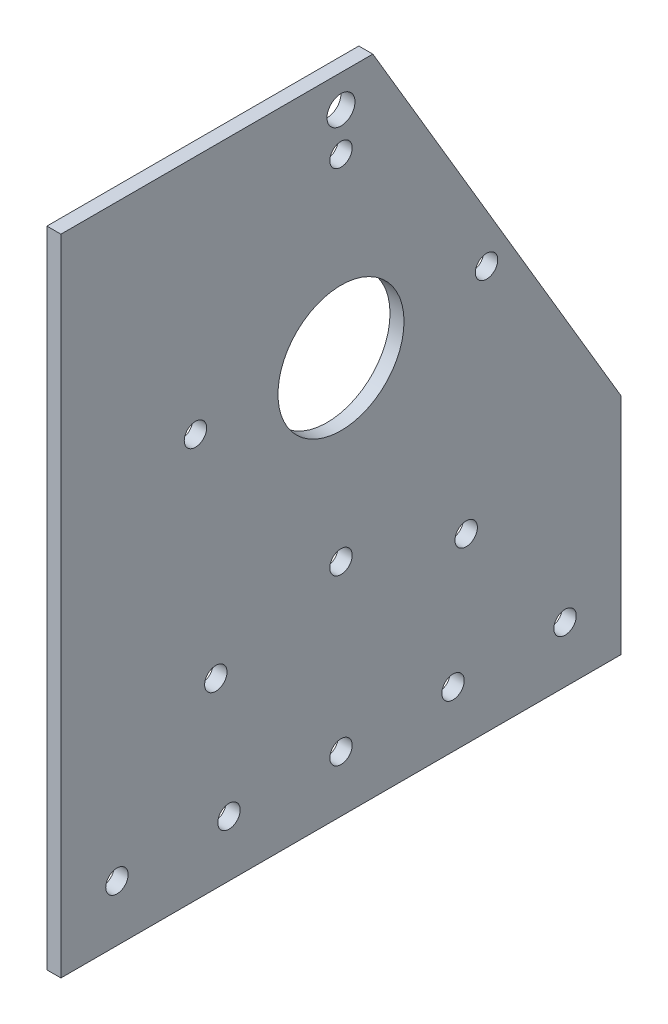
ISO-10303-21;
HEADER;
FILE_DESCRIPTION(('STEP AP214'),'2;1');
FILE_NAME('part.step','',(''),(''),'','','');
FILE_SCHEMA(('AUTOMOTIVE_DESIGN { 1 0 10303 214 1 1 1 1 }'));
ENDSEC;
DATA;
#1=APPLICATION_CONTEXT('core data for automotive mechanical design processes');
#2=APPLICATION_PROTOCOL_DEFINITION('international standard','automotive_design',2000,#1);
#3=PRODUCT_CONTEXT('',#1,'mechanical');
#4=PRODUCT('Part','Part','',(#3));
#5=PRODUCT_RELATED_PRODUCT_CATEGORY('part','',(#4));
#6=PRODUCT_DEFINITION_FORMATION('','',#4);
#7=PRODUCT_DEFINITION_CONTEXT('part definition',#1,'design');
#8=PRODUCT_DEFINITION('design','',#6,#7);
#9=PRODUCT_DEFINITION_SHAPE('','',#8);
#10=(LENGTH_UNIT() NAMED_UNIT(*) SI_UNIT(.MILLI.,.METRE.));
#11=(NAMED_UNIT(*) PLANE_ANGLE_UNIT() SI_UNIT($,.RADIAN.));
#12=(NAMED_UNIT(*) SI_UNIT($,.STERADIAN.) SOLID_ANGLE_UNIT());
#13=UNCERTAINTY_MEASURE_WITH_UNIT(LENGTH_MEASURE(1.E-05),#10,'distance_accuracy_value','');
#14=(GEOMETRIC_REPRESENTATION_CONTEXT(3) GLOBAL_UNCERTAINTY_ASSIGNED_CONTEXT((#13)) GLOBAL_UNIT_ASSIGNED_CONTEXT((#10,
#11,#12)) REPRESENTATION_CONTEXT('',''));
#15=CARTESIAN_POINT('',(0.,0.,0.));
#16=DIRECTION('',(0.,0.,1.));
#17=DIRECTION('',(1.,0.,0.));
#18=AXIS2_PLACEMENT_3D('',#15,#16,#17);
#19=CARTESIAN_POINT('',(-3.175,0.,0.));
#20=DIRECTION('',(-1.,0.,0.));
#21=DIRECTION('',(0.,0.,1.));
#22=AXIS2_PLACEMENT_3D('',#19,#20,#21);
#23=PLANE('',#22);
#24=CARTESIAN_POINT('',(-3.175,-82.55,25.4));
#25=DIRECTION('',(-1.,0.,0.));
#26=DIRECTION('',(0.,0.,1.));
#27=AXIS2_PLACEMENT_3D('',#24,#25,#26);
#28=CIRCLE('',#27,2.54);
#29=CARTESIAN_POINT('',(-3.175,-82.55,27.94));
#30=VERTEX_POINT('',#29);
#31=EDGE_CURVE('E186',#30,#30,#28,.T.);
#32=ORIENTED_EDGE('',*,*,#31,.F.);
#33=EDGE_LOOP('',(#32));
#34=FACE_BOUND('',#33,.T.);
#35=CARTESIAN_POINT('',(-3.175,-82.55,-25.4));
#36=DIRECTION('',(-1.,0.,0.));
#37=DIRECTION('',(0.,0.,1.));
#38=AXIS2_PLACEMENT_3D('',#35,#36,#37);
#39=CIRCLE('',#38,2.54);
#40=CARTESIAN_POINT('',(-3.175,-82.55,-22.86));
#41=VERTEX_POINT('',#40);
#42=EDGE_CURVE('E180',#41,#41,#39,.T.);
#43=ORIENTED_EDGE('',*,*,#42,.F.);
#44=EDGE_LOOP('',(#43));
#45=FACE_BOUND('',#44,.T.);
#46=CARTESIAN_POINT('',(-3.175,-82.55,50.8));
#47=DIRECTION('',(-1.,0.,0.));
#48=DIRECTION('',(0.,0.,1.));
#49=AXIS2_PLACEMENT_3D('',#46,#47,#48);
#50=CIRCLE('',#49,2.54);
#51=CARTESIAN_POINT('',(-3.175,-82.55,53.34));
#52=VERTEX_POINT('',#51);
#53=EDGE_CURVE('E174',#52,#52,#50,.T.);
#54=ORIENTED_EDGE('',*,*,#53,.F.);
#55=EDGE_LOOP('',(#54));
#56=FACE_BOUND('',#55,.T.);
#57=CARTESIAN_POINT('',(-3.175,-82.55,0.));
#58=DIRECTION('',(-1.,0.,0.));
#59=DIRECTION('',(0.,0.,1.));
#60=AXIS2_PLACEMENT_3D('',#57,#58,#59);
#61=CIRCLE('',#60,2.54);
#62=CARTESIAN_POINT('',(-3.175,-82.55,2.53999999999999));
#63=VERTEX_POINT('',#62);
#64=EDGE_CURVE('E168',#63,#63,#61,.T.);
#65=ORIENTED_EDGE('',*,*,#64,.F.);
#66=EDGE_LOOP('',(#65));
#67=FACE_BOUND('',#66,.T.);
#68=CARTESIAN_POINT('',(-3.175,-82.55,-50.8));
#69=DIRECTION('',(-1.,0.,0.));
#70=DIRECTION('',(0.,0.,1.));
#71=AXIS2_PLACEMENT_3D('',#68,#69,#70);
#72=CIRCLE('',#71,2.54);
#73=CARTESIAN_POINT('',(-3.175,-82.55,-48.26));
#74=VERTEX_POINT('',#73);
#75=EDGE_CURVE('E162',#74,#74,#72,.T.);
#76=ORIENTED_EDGE('',*,*,#75,.F.);
#77=EDGE_LOOP('',(#76));
#78=FACE_BOUND('',#77,.T.);
#79=CARTESIAN_POINT('',(-3.175,-45.239299666,0.));
#80=DIRECTION('',(-1.,0.,0.));
#81=DIRECTION('',(0.,0.,-1.));
#82=AXIS2_PLACEMENT_3D('',#79,#80,#81);
#83=CIRCLE('',#82,2.54);
#84=CARTESIAN_POINT('',(-3.175,-45.239299666,-2.54));
#85=VERTEX_POINT('',#84);
#86=EDGE_CURVE('E142',#85,#85,#83,.T.);
#87=ORIENTED_EDGE('',*,*,#86,.F.);
#88=EDGE_LOOP('',(#87));
#89=FACE_BOUND('',#88,.T.);
#90=CARTESIAN_POINT('',(-3.175,-3.74917106400003,-33.00000004));
#91=DIRECTION('',(-1.,0.,0.));
#92=DIRECTION('',(0.,0.,1.));
#93=AXIS2_PLACEMENT_3D('',#90,#91,#92);
#94=CIRCLE('',#93,2.54);
#95=CARTESIAN_POINT('',(-3.175,-3.74917106400003,-30.46000004));
#96=VERTEX_POINT('',#95);
#97=EDGE_CURVE('E136',#96,#96,#94,.T.);
#98=ORIENTED_EDGE('',*,*,#97,.F.);
#99=EDGE_LOOP('',(#98));
#100=FACE_BOUND('',#99,.T.);
#101=CARTESIAN_POINT('',(-3.175,-3.74917106400003,33.00000004));
#102=DIRECTION('',(-1.,0.,0.));
#103=DIRECTION('',(0.,0.,1.));
#104=AXIS2_PLACEMENT_3D('',#101,#102,#103);
#105=CIRCLE('',#104,2.54);
#106=CARTESIAN_POINT('',(-3.175,-3.74917106400003,35.54000004));
#107=VERTEX_POINT('',#106);
#108=EDGE_CURVE('E130',#107,#107,#105,.T.);
#109=ORIENTED_EDGE('',*,*,#108,.F.);
#110=EDGE_LOOP('',(#109));
#111=FACE_BOUND('',#110,.T.);
#112=CARTESIAN_POINT('',(-3.175,34.740957442,0.));
#113=DIRECTION('',(-1.,0.,0.));
#114=DIRECTION('',(0.,0.,1.));
#115=AXIS2_PLACEMENT_3D('',#112,#113,#114);
#116=CIRCLE('',#115,2.54);
#117=CARTESIAN_POINT('',(-3.175,34.740957442,2.54));
#118=VERTEX_POINT('',#117);
#119=EDGE_CURVE('E124',#118,#118,#116,.T.);
#120=ORIENTED_EDGE('',*,*,#119,.F.);
#121=EDGE_LOOP('',(#120));
#122=FACE_BOUND('',#121,.T.);
#123=CARTESIAN_POINT('',(-3.175,-5.24917111200003,0.));
#124=DIRECTION('',(1.,0.,0.));
#125=DIRECTION('',(0.,0.,-1.));
#126=AXIS2_PLACEMENT_3D('',#123,#124,#125);
#127=CIRCLE('',#126,14.2875);
#128=CARTESIAN_POINT('',(-3.175,-5.24917111200003,-14.2875));
#129=VERTEX_POINT('',#128);
#130=EDGE_CURVE('E115',#129,#129,#127,.T.);
#131=ORIENTED_EDGE('',*,*,#130,.T.);
#132=EDGE_LOOP('',(#131));
#133=FACE_BOUND('',#132,.T.);
#134=CARTESIAN_POINT('',(-3.175,43.476657776,0.));
#135=DIRECTION('',(1.,0.,0.));
#136=DIRECTION('',(0.,0.,-1.));
#137=AXIS2_PLACEMENT_3D('',#134,#135,#136);
#138=CIRCLE('',#137,3.175);
#139=CARTESIAN_POINT('',(-3.175,43.476657776,-3.17500000000001));
#140=VERTEX_POINT('',#139);
#141=EDGE_CURVE('E109',#140,#140,#138,.T.);
#142=ORIENTED_EDGE('',*,*,#141,.T.);
#143=EDGE_LOOP('',(#142));
#144=FACE_BOUND('',#143,.T.);
#145=CARTESIAN_POINT('',(-3.175,-53.975,-28.380000009));
#146=DIRECTION('',(1.,0.,0.));
#147=DIRECTION('',(0.,0.,-1.));
#148=AXIS2_PLACEMENT_3D('',#145,#146,#147);
#149=CIRCLE('',#148,2.54);
#150=CARTESIAN_POINT('',(-3.175,-53.975,-30.920000009));
#151=VERTEX_POINT('',#150);
#152=EDGE_CURVE('E103',#151,#151,#149,.T.);
#153=ORIENTED_EDGE('',*,*,#152,.T.);
#154=EDGE_LOOP('',(#153));
#155=FACE_BOUND('',#154,.T.);
#156=CARTESIAN_POINT('',(-3.175,-53.975,28.380000009));
#157=DIRECTION('',(1.,0.,0.));
#158=DIRECTION('',(0.,0.,-1.));
#159=AXIS2_PLACEMENT_3D('',#156,#157,#158);
#160=CIRCLE('',#159,2.54);
#161=CARTESIAN_POINT('',(-3.175,-53.975,25.840000009));
#162=VERTEX_POINT('',#161);
#163=EDGE_CURVE('E87',#162,#162,#160,.T.);
#164=ORIENTED_EDGE('',*,*,#163,.T.);
#165=EDGE_LOOP('',(#164));
#166=FACE_BOUND('',#165,.T.);
#167=DIRECTION('',(0.,-1.,0.));
#168=VECTOR('',#167,1.);
#169=CARTESIAN_POINT('',(-3.175,-95.25,63.5));
#170=LINE('',#169,#168);
#171=CARTESIAN_POINT('',(-3.175,50.8,63.5));
#172=VERTEX_POINT('',#171);
#173=CARTESIAN_POINT('',(-3.175,-95.25,63.5));
#174=VERTEX_POINT('',#173);
#175=EDGE_CURVE('E94',#172,#174,#170,.T.);
#176=ORIENTED_EDGE('',*,*,#175,.F.);
#177=DIRECTION('',(0.,0.,1.));
#178=VECTOR('',#177,1.);
#179=CARTESIAN_POINT('',(-3.175,50.8,63.5));
#180=LINE('',#179,#178);
#181=CARTESIAN_POINT('',(-3.175,50.8,-7.21590909090913));
#182=VERTEX_POINT('',#181);
#183=EDGE_CURVE('E157',#182,#172,#180,.T.);
#184=ORIENTED_EDGE('',*,*,#183,.F.);
#185=DIRECTION('',(0.,0.860926528214316,0.508729312126641));
#186=VECTOR('',#185,1.);
#187=CARTESIAN_POINT('',(-3.175,16.3077335375192,-27.5977029096478));
#188=LINE('',#187,#186);
#189=CARTESIAN_POINT('',(-3.175,-44.45,-63.5));
#190=VERTEX_POINT('',#189);
#191=EDGE_CURVE('E149',#190,#182,#188,.T.);
#192=ORIENTED_EDGE('',*,*,#191,.F.);
#193=DIRECTION('',(0.,1.,0.));
#194=VECTOR('',#193,1.);
#195=CARTESIAN_POINT('',(-3.175,-95.25,-63.5));
#196=LINE('',#195,#194);
#197=CARTESIAN_POINT('',(-3.175,-95.25,-63.5));
#198=VERTEX_POINT('',#197);
#199=EDGE_CURVE('E92',#198,#190,#196,.T.);
#200=ORIENTED_EDGE('',*,*,#199,.F.);
#201=DIRECTION('',(0.,0.,-1.));
#202=VECTOR('',#201,1.);
#203=CARTESIAN_POINT('',(-3.175,-95.25,63.5));
#204=LINE('',#203,#202);
#205=EDGE_CURVE('E78',#174,#198,#204,.T.);
#206=ORIENTED_EDGE('',*,*,#205,.F.);
#207=EDGE_LOOP('',(#176,#184,#192,#200,#206));
#208=FACE_BOUND('',#207,.T.);
#209=ADVANCED_FACE('F38',(#34,#45,#56,#67,#78,#89,#100,#111,#122,#133,#144,#155,#166,#208),#23,.T.);
#210=CARTESIAN_POINT('',(0.,0.,0.));
#211=DIRECTION('',(-1.,0.,0.));
#212=DIRECTION('',(0.,0.,1.));
#213=AXIS2_PLACEMENT_3D('',#210,#211,#212);
#214=PLANE('',#213);
#215=CARTESIAN_POINT('',(0.,-82.55,25.4));
#216=DIRECTION('',(-1.,0.,0.));
#217=DIRECTION('',(0.,0.,1.));
#218=AXIS2_PLACEMENT_3D('',#215,#216,#217);
#219=CIRCLE('',#218,2.54);
#220=CARTESIAN_POINT('',(0.,-82.55,27.94));
#221=VERTEX_POINT('',#220);
#222=EDGE_CURVE('E183',#221,#221,#219,.T.);
#223=ORIENTED_EDGE('',*,*,#222,.T.);
#224=EDGE_LOOP('',(#223));
#225=FACE_BOUND('',#224,.T.);
#226=CARTESIAN_POINT('',(0.,-82.55,-25.4));
#227=DIRECTION('',(-1.,0.,0.));
#228=DIRECTION('',(0.,0.,1.));
#229=AXIS2_PLACEMENT_3D('',#226,#227,#228);
#230=CIRCLE('',#229,2.54);
#231=CARTESIAN_POINT('',(0.,-82.55,-22.86));
#232=VERTEX_POINT('',#231);
#233=EDGE_CURVE('E177',#232,#232,#230,.T.);
#234=ORIENTED_EDGE('',*,*,#233,.T.);
#235=EDGE_LOOP('',(#234));
#236=FACE_BOUND('',#235,.T.);
#237=CARTESIAN_POINT('',(0.,-82.55,50.8));
#238=DIRECTION('',(-1.,0.,0.));
#239=DIRECTION('',(0.,0.,1.));
#240=AXIS2_PLACEMENT_3D('',#237,#238,#239);
#241=CIRCLE('',#240,2.54);
#242=CARTESIAN_POINT('',(0.,-82.55,53.34));
#243=VERTEX_POINT('',#242);
#244=EDGE_CURVE('E171',#243,#243,#241,.T.);
#245=ORIENTED_EDGE('',*,*,#244,.T.);
#246=EDGE_LOOP('',(#245));
#247=FACE_BOUND('',#246,.T.);
#248=CARTESIAN_POINT('',(0.,-82.55,0.));
#249=DIRECTION('',(-1.,0.,0.));
#250=DIRECTION('',(0.,0.,1.));
#251=AXIS2_PLACEMENT_3D('',#248,#249,#250);
#252=CIRCLE('',#251,2.54);
#253=CARTESIAN_POINT('',(0.,-82.55,2.53999999999999));
#254=VERTEX_POINT('',#253);
#255=EDGE_CURVE('E165',#254,#254,#252,.T.);
#256=ORIENTED_EDGE('',*,*,#255,.T.);
#257=EDGE_LOOP('',(#256));
#258=FACE_BOUND('',#257,.T.);
#259=CARTESIAN_POINT('',(0.,-82.55,-50.8));
#260=DIRECTION('',(-1.,0.,0.));
#261=DIRECTION('',(0.,0.,1.));
#262=AXIS2_PLACEMENT_3D('',#259,#260,#261);
#263=CIRCLE('',#262,2.54);
#264=CARTESIAN_POINT('',(0.,-82.55,-48.26));
#265=VERTEX_POINT('',#264);
#266=EDGE_CURVE('E160',#265,#265,#263,.T.);
#267=ORIENTED_EDGE('',*,*,#266,.T.);
#268=EDGE_LOOP('',(#267));
#269=FACE_BOUND('',#268,.T.);
#270=CARTESIAN_POINT('',(0.,-45.239299666,0.));
#271=DIRECTION('',(-1.,0.,0.));
#272=DIRECTION('',(0.,0.,-1.));
#273=AXIS2_PLACEMENT_3D('',#270,#271,#272);
#274=CIRCLE('',#273,2.54);
#275=CARTESIAN_POINT('',(0.,-45.239299666,-2.54));
#276=VERTEX_POINT('',#275);
#277=EDGE_CURVE('E139',#276,#276,#274,.T.);
#278=ORIENTED_EDGE('',*,*,#277,.T.);
#279=EDGE_LOOP('',(#278));
#280=FACE_BOUND('',#279,.T.);
#281=CARTESIAN_POINT('',(0.,-3.74917106400003,-33.00000004));
#282=DIRECTION('',(-1.,0.,0.));
#283=DIRECTION('',(0.,0.,1.));
#284=AXIS2_PLACEMENT_3D('',#281,#282,#283);
#285=CIRCLE('',#284,2.54);
#286=CARTESIAN_POINT('',(0.,-3.74917106400003,-30.46000004));
#287=VERTEX_POINT('',#286);
#288=EDGE_CURVE('E133',#287,#287,#285,.T.);
#289=ORIENTED_EDGE('',*,*,#288,.T.);
#290=EDGE_LOOP('',(#289));
#291=FACE_BOUND('',#290,.T.);
#292=CARTESIAN_POINT('',(0.,-3.74917106400003,33.00000004));
#293=DIRECTION('',(-1.,0.,0.));
#294=DIRECTION('',(0.,0.,1.));
#295=AXIS2_PLACEMENT_3D('',#292,#293,#294);
#296=CIRCLE('',#295,2.54);
#297=CARTESIAN_POINT('',(0.,-3.74917106400003,35.54000004));
#298=VERTEX_POINT('',#297);
#299=EDGE_CURVE('E127',#298,#298,#296,.T.);
#300=ORIENTED_EDGE('',*,*,#299,.T.);
#301=EDGE_LOOP('',(#300));
#302=FACE_BOUND('',#301,.T.);
#303=CARTESIAN_POINT('',(0.,34.740957442,0.));
#304=DIRECTION('',(-1.,0.,0.));
#305=DIRECTION('',(0.,0.,1.));
#306=AXIS2_PLACEMENT_3D('',#303,#304,#305);
#307=CIRCLE('',#306,2.54);
#308=CARTESIAN_POINT('',(0.,34.740957442,2.54));
#309=VERTEX_POINT('',#308);
#310=EDGE_CURVE('E121',#309,#309,#307,.T.);
#311=ORIENTED_EDGE('',*,*,#310,.T.);
#312=EDGE_LOOP('',(#311));
#313=FACE_BOUND('',#312,.T.);
#314=CARTESIAN_POINT('',(0.,-5.24917111200003,0.));
#315=DIRECTION('',(1.,0.,0.));
#316=DIRECTION('',(0.,0.,-1.));
#317=AXIS2_PLACEMENT_3D('',#314,#315,#316);
#318=CIRCLE('',#317,14.2875);
#319=CARTESIAN_POINT('',(0.,-5.24917111200003,-14.2875));
#320=VERTEX_POINT('',#319);
#321=EDGE_CURVE('E118',#320,#320,#318,.T.);
#322=ORIENTED_EDGE('',*,*,#321,.F.);
#323=EDGE_LOOP('',(#322));
#324=FACE_BOUND('',#323,.T.);
#325=CARTESIAN_POINT('',(0.,43.476657776,0.));
#326=DIRECTION('',(1.,0.,0.));
#327=DIRECTION('',(0.,0.,-1.));
#328=AXIS2_PLACEMENT_3D('',#325,#326,#327);
#329=CIRCLE('',#328,3.175);
#330=CARTESIAN_POINT('',(0.,43.476657776,-3.17500000000001));
#331=VERTEX_POINT('',#330);
#332=EDGE_CURVE('E112',#331,#331,#329,.T.);
#333=ORIENTED_EDGE('',*,*,#332,.F.);
#334=EDGE_LOOP('',(#333));
#335=FACE_BOUND('',#334,.T.);
#336=CARTESIAN_POINT('',(0.,-53.975,-28.380000009));
#337=DIRECTION('',(1.,0.,0.));
#338=DIRECTION('',(0.,0.,-1.));
#339=AXIS2_PLACEMENT_3D('',#336,#337,#338);
#340=CIRCLE('',#339,2.54);
#341=CARTESIAN_POINT('',(0.,-53.975,-30.920000009));
#342=VERTEX_POINT('',#341);
#343=EDGE_CURVE('E106',#342,#342,#340,.T.);
#344=ORIENTED_EDGE('',*,*,#343,.F.);
#345=EDGE_LOOP('',(#344));
#346=FACE_BOUND('',#345,.T.);
#347=CARTESIAN_POINT('',(0.,-53.975,28.380000009));
#348=DIRECTION('',(1.,0.,0.));
#349=DIRECTION('',(0.,0.,-1.));
#350=AXIS2_PLACEMENT_3D('',#347,#348,#349);
#351=CIRCLE('',#350,2.54);
#352=CARTESIAN_POINT('',(0.,-53.975,25.840000009));
#353=VERTEX_POINT('',#352);
#354=EDGE_CURVE('E100',#353,#353,#351,.T.);
#355=ORIENTED_EDGE('',*,*,#354,.F.);
#356=EDGE_LOOP('',(#355));
#357=FACE_BOUND('',#356,.T.);
#358=DIRECTION('',(0.,0.,1.));
#359=VECTOR('',#358,1.);
#360=CARTESIAN_POINT('',(0.,50.8,0.));
#361=LINE('',#360,#359);
#362=CARTESIAN_POINT('',(0.,50.8,-7.21590909090913));
#363=VERTEX_POINT('',#362);
#364=CARTESIAN_POINT('',(0.,50.8,63.5));
#365=VERTEX_POINT('',#364);
#366=EDGE_CURVE('E53',#363,#365,#361,.T.);
#367=ORIENTED_EDGE('',*,*,#366,.T.);
#368=DIRECTION('',(0.,-1.,0.));
#369=VECTOR('',#368,1.);
#370=CARTESIAN_POINT('',(0.,-95.25,63.5));
#371=LINE('',#370,#369);
#372=CARTESIAN_POINT('',(0.,-95.25,63.5));
#373=VERTEX_POINT('',#372);
#374=EDGE_CURVE('E86',#365,#373,#371,.T.);
#375=ORIENTED_EDGE('',*,*,#374,.T.);
#376=DIRECTION('',(0.,0.,-1.));
#377=VECTOR('',#376,1.);
#378=CARTESIAN_POINT('',(0.,-95.25,63.5));
#379=LINE('',#378,#377);
#380=CARTESIAN_POINT('',(0.,-95.25,-63.5));
#381=VERTEX_POINT('',#380);
#382=EDGE_CURVE('E76',#373,#381,#379,.T.);
#383=ORIENTED_EDGE('',*,*,#382,.T.);
#384=DIRECTION('',(0.,1.,0.));
#385=VECTOR('',#384,1.);
#386=CARTESIAN_POINT('',(0.,-95.25,-63.5));
#387=LINE('',#386,#385);
#388=CARTESIAN_POINT('',(0.,-44.45,-63.5));
#389=VERTEX_POINT('',#388);
#390=EDGE_CURVE('E81',#381,#389,#387,.T.);
#391=ORIENTED_EDGE('',*,*,#390,.T.);
#392=DIRECTION('',(0.,0.860926528214316,0.508729312126641));
#393=VECTOR('',#392,1.);
#394=CARTESIAN_POINT('',(0.,16.3077335375192,-27.5977029096478));
#395=LINE('',#394,#393);
#396=EDGE_CURVE('E148',#389,#363,#395,.T.);
#397=ORIENTED_EDGE('',*,*,#396,.T.);
#398=EDGE_LOOP('',(#367,#375,#383,#391,#397));
#399=FACE_BOUND('',#398,.T.);
#400=ADVANCED_FACE('F89',(#225,#236,#247,#258,#269,#280,#291,#302,#313,#324,#335,#346,#357,
#399),#214,.F.);
#401=CARTESIAN_POINT('',(-3.175,-95.25,63.5));
#402=DIRECTION('',(0.,0.,1.));
#403=DIRECTION('',(1.,0.,0.));
#404=AXIS2_PLACEMENT_3D('',#401,#402,#403);
#405=PLANE('',#404);
#406=ORIENTED_EDGE('',*,*,#374,.F.);
#407=DIRECTION('',(-1.,0.,0.));
#408=VECTOR('',#407,1.);
#409=CARTESIAN_POINT('',(-3.175,50.8,63.5));
#410=LINE('',#409,#408);
#411=EDGE_CURVE('E152',#172,#365,#410,.F.);
#412=ORIENTED_EDGE('',*,*,#411,.F.);
#413=ORIENTED_EDGE('',*,*,#175,.T.);
#414=DIRECTION('',(1.,0.,0.));
#415=VECTOR('',#414,1.);
#416=CARTESIAN_POINT('',(-3.175,-95.25,63.5));
#417=LINE('',#416,#415);
#418=EDGE_CURVE('E42',#174,#373,#417,.T.);
#419=ORIENTED_EDGE('',*,*,#418,.T.);
#420=EDGE_LOOP('',(#406,#412,#413,#419));
#421=FACE_BOUND('',#420,.T.);
#422=ADVANCED_FACE('F237',(#421),#405,.T.);
#423=CARTESIAN_POINT('',(-3.175,16.3077335375192,-27.5977029096478));
#424=DIRECTION('',(0.,-0.508729312126641,0.860926528214316));
#425=DIRECTION('',(0.,0.860926528214316,0.508729312126641));
#426=AXIS2_PLACEMENT_3D('',#423,#424,#425);
#427=PLANE('',#426);
#428=ORIENTED_EDGE('',*,*,#191,.T.);
#429=DIRECTION('',(-1.,0.,0.));
#430=VECTOR('',#429,1.);
#431=CARTESIAN_POINT('',(-3.175,50.8,-7.21590909090913));
#432=LINE('',#431,#430);
#433=EDGE_CURVE('E154',#182,#363,#432,.F.);
#434=ORIENTED_EDGE('',*,*,#433,.T.);
#435=ORIENTED_EDGE('',*,*,#396,.F.);
#436=DIRECTION('',(-1.,0.,0.));
#437=VECTOR('',#436,1.);
#438=CARTESIAN_POINT('',(-3.175,-44.45,-63.5));
#439=LINE('',#438,#437);
#440=EDGE_CURVE('E83',#190,#389,#439,.F.);
#441=ORIENTED_EDGE('',*,*,#440,.F.);
#442=EDGE_LOOP('',(#428,#434,#435,#441));
#443=FACE_BOUND('',#442,.T.);
#444=ADVANCED_FACE('F243',(#443),#427,.F.);
#445=CARTESIAN_POINT('',(-3.175,-95.25,-63.5));
#446=DIRECTION('',(0.,0.,-1.));
#447=DIRECTION('',(-1.,0.,0.));
#448=AXIS2_PLACEMENT_3D('',#445,#446,#447);
#449=PLANE('',#448);
#450=ORIENTED_EDGE('',*,*,#199,.T.);
#451=ORIENTED_EDGE('',*,*,#440,.T.);
#452=ORIENTED_EDGE('',*,*,#390,.F.);
#453=DIRECTION('',(1.,0.,0.));
#454=VECTOR('',#453,1.);
#455=CARTESIAN_POINT('',(-3.175,-95.25,-63.5));
#456=LINE('',#455,#454);
#457=EDGE_CURVE('E11',#198,#381,#456,.T.);
#458=ORIENTED_EDGE('',*,*,#457,.F.);
#459=EDGE_LOOP('',(#450,#451,#452,#458));
#460=FACE_BOUND('',#459,.T.);
#461=ADVANCED_FACE('F40',(#460),#449,.T.);
#462=CARTESIAN_POINT('',(-3.175,-95.25,63.5));
#463=DIRECTION('',(0.,-1.,0.));
#464=DIRECTION('',(0.,0.,-1.));
#465=AXIS2_PLACEMENT_3D('',#462,#463,#464);
#466=PLANE('',#465);
#467=ORIENTED_EDGE('',*,*,#382,.F.);
#468=ORIENTED_EDGE('',*,*,#418,.F.);
#469=ORIENTED_EDGE('',*,*,#205,.T.);
#470=ORIENTED_EDGE('',*,*,#457,.T.);
#471=EDGE_LOOP('',(#467,#468,#469,#470));
#472=FACE_BOUND('',#471,.T.);
#473=ADVANCED_FACE('F73',(#472),#466,.T.);
#474=CARTESIAN_POINT('',(-3.175,-53.975,28.380000009));
#475=DIRECTION('',(1.,0.,0.));
#476=DIRECTION('',(0.,0.,-1.));
#477=AXIS2_PLACEMENT_3D('',#474,#475,#476);
#478=CYLINDRICAL_SURFACE('',#477,2.54);
#479=ORIENTED_EDGE('',*,*,#163,.F.);
#480=EDGE_LOOP('',(#479));
#481=FACE_BOUND('',#480,.T.);
#482=ORIENTED_EDGE('',*,*,#354,.T.);
#483=EDGE_LOOP('',(#482));
#484=FACE_BOUND('',#483,.T.);
#485=ADVANCED_FACE('F282',(#481,#484),#478,.F.);
#486=CARTESIAN_POINT('',(-3.175,-53.975,-28.380000009));
#487=DIRECTION('',(1.,0.,0.));
#488=DIRECTION('',(0.,0.,-1.));
#489=AXIS2_PLACEMENT_3D('',#486,#487,#488);
#490=CYLINDRICAL_SURFACE('',#489,2.54);
#491=ORIENTED_EDGE('',*,*,#152,.F.);
#492=EDGE_LOOP('',(#491));
#493=FACE_BOUND('',#492,.T.);
#494=ORIENTED_EDGE('',*,*,#343,.T.);
#495=EDGE_LOOP('',(#494));
#496=FACE_BOUND('',#495,.T.);
#497=ADVANCED_FACE('F278',(#493,#496),#490,.F.);
#498=CARTESIAN_POINT('',(-3.175,43.476657776,0.));
#499=DIRECTION('',(1.,0.,0.));
#500=DIRECTION('',(0.,0.,-1.));
#501=AXIS2_PLACEMENT_3D('',#498,#499,#500);
#502=CYLINDRICAL_SURFACE('',#501,3.175);
#503=ORIENTED_EDGE('',*,*,#141,.F.);
#504=EDGE_LOOP('',(#503));
#505=FACE_BOUND('',#504,.T.);
#506=ORIENTED_EDGE('',*,*,#332,.T.);
#507=EDGE_LOOP('',(#506));
#508=FACE_BOUND('',#507,.T.);
#509=ADVANCED_FACE('F274',(#505,#508),#502,.F.);
#510=CARTESIAN_POINT('',(-3.175,-5.24917111200003,0.));
#511=DIRECTION('',(1.,0.,0.));
#512=DIRECTION('',(0.,0.,-1.));
#513=AXIS2_PLACEMENT_3D('',#510,#511,#512);
#514=CYLINDRICAL_SURFACE('',#513,14.2875);
#515=ORIENTED_EDGE('',*,*,#130,.F.);
#516=EDGE_LOOP('',(#515));
#517=FACE_BOUND('',#516,.T.);
#518=ORIENTED_EDGE('',*,*,#321,.T.);
#519=EDGE_LOOP('',(#518));
#520=FACE_BOUND('',#519,.T.);
#521=ADVANCED_FACE('F270',(#517,#520),#514,.F.);
#522=CARTESIAN_POINT('',(0.,34.740957442,0.));
#523=DIRECTION('',(-1.,0.,0.));
#524=DIRECTION('',(0.,0.,1.));
#525=AXIS2_PLACEMENT_3D('',#522,#523,#524);
#526=CYLINDRICAL_SURFACE('',#525,2.54);
#527=ORIENTED_EDGE('',*,*,#310,.F.);
#528=EDGE_LOOP('',(#527));
#529=FACE_BOUND('',#528,.T.);
#530=ORIENTED_EDGE('',*,*,#119,.T.);
#531=EDGE_LOOP('',(#530));
#532=FACE_BOUND('',#531,.T.);
#533=ADVANCED_FACE('F266',(#529,#532),#526,.F.);
#534=CARTESIAN_POINT('',(0.,-3.74917106400003,33.00000004));
#535=DIRECTION('',(-1.,0.,0.));
#536=DIRECTION('',(0.,0.,1.));
#537=AXIS2_PLACEMENT_3D('',#534,#535,#536);
#538=CYLINDRICAL_SURFACE('',#537,2.54);
#539=ORIENTED_EDGE('',*,*,#299,.F.);
#540=EDGE_LOOP('',(#539));
#541=FACE_BOUND('',#540,.T.);
#542=ORIENTED_EDGE('',*,*,#108,.T.);
#543=EDGE_LOOP('',(#542));
#544=FACE_BOUND('',#543,.T.);
#545=ADVANCED_FACE('F262',(#541,#544),#538,.F.);
#546=CARTESIAN_POINT('',(0.,-3.74917106400003,-33.00000004));
#547=DIRECTION('',(-1.,0.,0.));
#548=DIRECTION('',(0.,0.,1.));
#549=AXIS2_PLACEMENT_3D('',#546,#547,#548);
#550=CYLINDRICAL_SURFACE('',#549,2.54);
#551=ORIENTED_EDGE('',*,*,#288,.F.);
#552=EDGE_LOOP('',(#551));
#553=FACE_BOUND('',#552,.T.);
#554=ORIENTED_EDGE('',*,*,#97,.T.);
#555=EDGE_LOOP('',(#554));
#556=FACE_BOUND('',#555,.T.);
#557=ADVANCED_FACE('F258',(#553,#556),#550,.F.);
#558=CARTESIAN_POINT('',(0.,-45.239299666,0.));
#559=DIRECTION('',(-1.,0.,0.));
#560=DIRECTION('',(0.,0.,1.));
#561=AXIS2_PLACEMENT_3D('',#558,#559,#560);
#562=CYLINDRICAL_SURFACE('',#561,2.54);
#563=ORIENTED_EDGE('',*,*,#277,.F.);
#564=EDGE_LOOP('',(#563));
#565=FACE_BOUND('',#564,.T.);
#566=ORIENTED_EDGE('',*,*,#86,.T.);
#567=EDGE_LOOP('',(#566));
#568=FACE_BOUND('',#567,.T.);
#569=ADVANCED_FACE('F255',(#565,#568),#562,.F.);
#570=CARTESIAN_POINT('',(-3.175,50.8,63.5));
#571=DIRECTION('',(0.,-1.,0.));
#572=DIRECTION('',(0.,0.,1.));
#573=AXIS2_PLACEMENT_3D('',#570,#571,#572);
#574=PLANE('',#573);
#575=ORIENTED_EDGE('',*,*,#183,.T.);
#576=ORIENTED_EDGE('',*,*,#411,.T.);
#577=ORIENTED_EDGE('',*,*,#366,.F.);
#578=ORIENTED_EDGE('',*,*,#433,.F.);
#579=EDGE_LOOP('',(#575,#576,#577,#578));
#580=FACE_BOUND('',#579,.T.);
#581=ADVANCED_FACE('F238',(#580),#574,.F.);
#582=CARTESIAN_POINT('',(0.,-82.55,-50.8));
#583=DIRECTION('',(-1.,0.,0.));
#584=DIRECTION('',(0.,0.,1.));
#585=AXIS2_PLACEMENT_3D('',#582,#583,#584);
#586=CYLINDRICAL_SURFACE('',#585,2.54);
#587=ORIENTED_EDGE('',*,*,#266,.F.);
#588=EDGE_LOOP('',(#587));
#589=FACE_BOUND('',#588,.T.);
#590=ORIENTED_EDGE('',*,*,#75,.T.);
#591=EDGE_LOOP('',(#590));
#592=FACE_BOUND('',#591,.T.);
#593=ADVANCED_FACE('F332',(#589,#592),#586,.F.);
#594=CARTESIAN_POINT('',(0.,-82.55,0.));
#595=DIRECTION('',(-1.,0.,0.));
#596=DIRECTION('',(0.,0.,1.));
#597=AXIS2_PLACEMENT_3D('',#594,#595,#596);
#598=CYLINDRICAL_SURFACE('',#597,2.54);
#599=ORIENTED_EDGE('',*,*,#255,.F.);
#600=EDGE_LOOP('',(#599));
#601=FACE_BOUND('',#600,.T.);
#602=ORIENTED_EDGE('',*,*,#64,.T.);
#603=EDGE_LOOP('',(#602));
#604=FACE_BOUND('',#603,.T.);
#605=ADVANCED_FACE('F339',(#601,#604),#598,.F.);
#606=CARTESIAN_POINT('',(0.,-82.55,50.8));
#607=DIRECTION('',(-1.,0.,0.));
#608=DIRECTION('',(0.,0.,1.));
#609=AXIS2_PLACEMENT_3D('',#606,#607,#608);
#610=CYLINDRICAL_SURFACE('',#609,2.54);
#611=ORIENTED_EDGE('',*,*,#244,.F.);
#612=EDGE_LOOP('',(#611));
#613=FACE_BOUND('',#612,.T.);
#614=ORIENTED_EDGE('',*,*,#53,.T.);
#615=EDGE_LOOP('',(#614));
#616=FACE_BOUND('',#615,.T.);
#617=ADVANCED_FACE('F347',(#613,#616),#610,.F.);
#618=CARTESIAN_POINT('',(0.,-82.55,-25.4));
#619=DIRECTION('',(-1.,0.,0.));
#620=DIRECTION('',(0.,0.,1.));
#621=AXIS2_PLACEMENT_3D('',#618,#619,#620);
#622=CYLINDRICAL_SURFACE('',#621,2.54);
#623=ORIENTED_EDGE('',*,*,#233,.F.);
#624=EDGE_LOOP('',(#623));
#625=FACE_BOUND('',#624,.T.);
#626=ORIENTED_EDGE('',*,*,#42,.T.);
#627=EDGE_LOOP('',(#626));
#628=FACE_BOUND('',#627,.T.);
#629=ADVANCED_FACE('F197',(#625,#628),#622,.F.);
#630=CARTESIAN_POINT('',(0.,-82.55,25.4));
#631=DIRECTION('',(-1.,0.,0.));
#632=DIRECTION('',(0.,0.,1.));
#633=AXIS2_PLACEMENT_3D('',#630,#631,#632);
#634=CYLINDRICAL_SURFACE('',#633,2.54);
#635=ORIENTED_EDGE('',*,*,#222,.F.);
#636=EDGE_LOOP('',(#635));
#637=FACE_BOUND('',#636,.T.);
#638=ORIENTED_EDGE('',*,*,#31,.T.);
#639=EDGE_LOOP('',(#638));
#640=FACE_BOUND('',#639,.T.);
#641=ADVANCED_FACE('F194',(#637,#640),#634,.F.);
#642=CLOSED_SHELL('',(#209,#400,#422,#444,#461,#473,#485,#497,#509,#521,#533,#545,#557,#569,
#581,#593,#605,#617,#629,#641));
#643=MANIFOLD_SOLID_BREP('B2',#642);
#644=ADVANCED_BREP_SHAPE_REPRESENTATION('',(#18,#643),#14);
#645=SHAPE_DEFINITION_REPRESENTATION(#9,#644);
ENDSEC;
END-ISO-10303-21;
